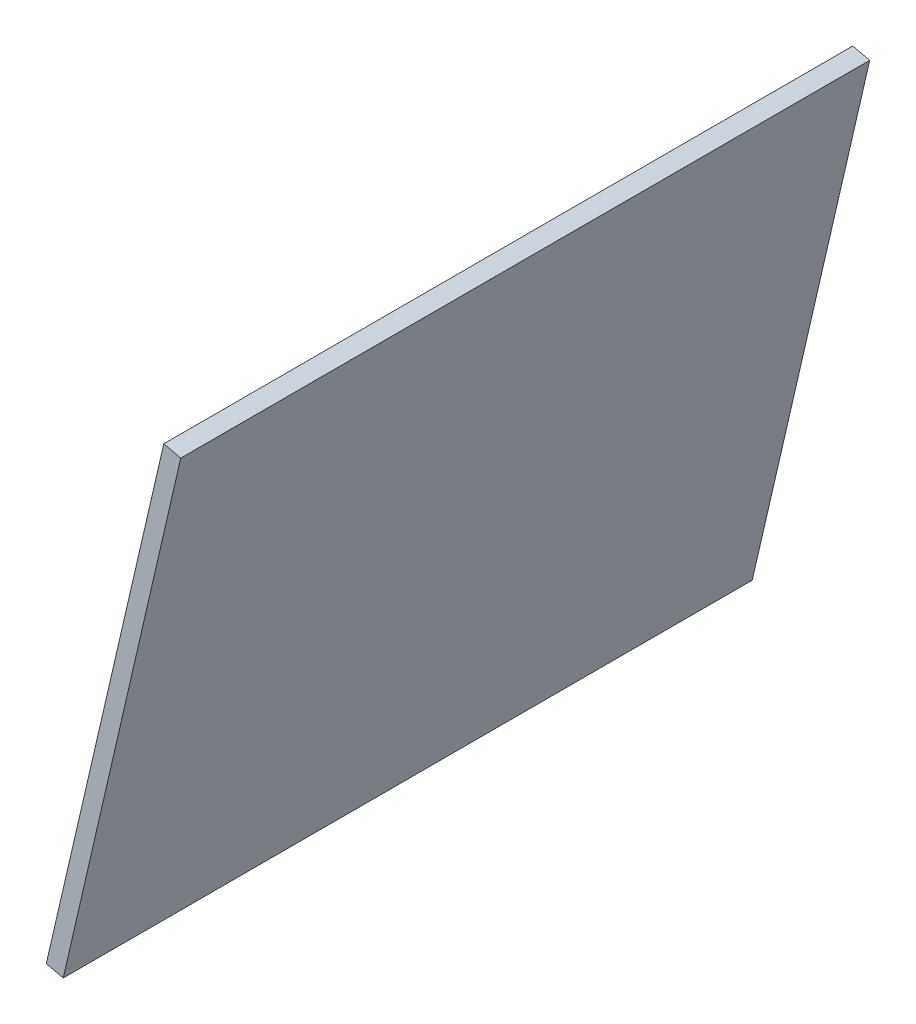
ISO-10303-21;
HEADER;
FILE_DESCRIPTION(('STEP AP214'),'2;1');
FILE_NAME('part.step','',(''),(''),'','','');
FILE_SCHEMA(('AUTOMOTIVE_DESIGN { 1 0 10303 214 1 1 1 1 }'));
ENDSEC;
DATA;
#1=APPLICATION_CONTEXT('core data for automotive mechanical design processes');
#2=APPLICATION_PROTOCOL_DEFINITION('international standard','automotive_design',2000,#1);
#3=PRODUCT_CONTEXT('',#1,'mechanical');
#4=PRODUCT('Part','Part','',(#3));
#5=PRODUCT_RELATED_PRODUCT_CATEGORY('part','',(#4));
#6=PRODUCT_DEFINITION_FORMATION('','',#4);
#7=PRODUCT_DEFINITION_CONTEXT('part definition',#1,'design');
#8=PRODUCT_DEFINITION('design','',#6,#7);
#9=PRODUCT_DEFINITION_SHAPE('','',#8);
#10=(LENGTH_UNIT() NAMED_UNIT(*) SI_UNIT(.MILLI.,.METRE.));
#11=(NAMED_UNIT(*) PLANE_ANGLE_UNIT() SI_UNIT($,.RADIAN.));
#12=(NAMED_UNIT(*) SI_UNIT($,.STERADIAN.) SOLID_ANGLE_UNIT());
#13=UNCERTAINTY_MEASURE_WITH_UNIT(LENGTH_MEASURE(1.E-05),#10,'distance_accuracy_value','');
#14=(GEOMETRIC_REPRESENTATION_CONTEXT(3) GLOBAL_UNCERTAINTY_ASSIGNED_CONTEXT((#13)) GLOBAL_UNIT_ASSIGNED_CONTEXT((#10,
#11,#12)) REPRESENTATION_CONTEXT('',''));
#15=CARTESIAN_POINT('',(0.,0.,0.));
#16=DIRECTION('',(0.,0.,1.));
#17=DIRECTION('',(1.,0.,0.));
#18=AXIS2_PLACEMENT_3D('',#15,#16,#17);
#19=CARTESIAN_POINT('',(164.308235452831,1831.59349845867,402.));
#20=DIRECTION('',(-0.224951054343888,-0.97437006478523,0.));
#21=DIRECTION('',(0.97437006478523,-0.224951054343888,0.));
#22=AXIS2_PLACEMENT_3D('',#19,#20,#21);
#23=PLANE('',#22);
#24=DIRECTION('',(-0.97437006478523,0.224951054343888,0.));
#25=VECTOR('',#24,1.);
#26=CARTESIAN_POINT('',(164.308235452831,1831.59349845867,0.));
#27=LINE('',#26,#25);
#28=CARTESIAN_POINT('',(174.20783531105,1829.30799574654,0.));
#29=VERTEX_POINT('',#28);
#30=CARTESIAN_POINT('',(164.308235452831,1831.59349845867,0.));
#31=VERTEX_POINT('',#30);
#32=EDGE_CURVE('E99',#29,#31,#27,.T.);
#33=ORIENTED_EDGE('',*,*,#32,.T.);
#34=DIRECTION('',(0.,0.,-1.));
#35=VECTOR('',#34,1.);
#36=CARTESIAN_POINT('',(164.308235452831,1831.59349845867,402.));
#37=LINE('',#36,#35);
#38=CARTESIAN_POINT('',(164.308235452831,1831.59349845867,402.));
#39=VERTEX_POINT('',#38);
#40=EDGE_CURVE('E11',#39,#31,#37,.T.);
#41=ORIENTED_EDGE('',*,*,#40,.F.);
#42=DIRECTION('',(-0.97437006478523,0.224951054343888,0.));
#43=VECTOR('',#42,1.);
#44=CARTESIAN_POINT('',(164.308235452831,1831.59349845867,402.));
#45=LINE('',#44,#43);
#46=CARTESIAN_POINT('',(174.20783531105,1829.30799574654,402.));
#47=VERTEX_POINT('',#46);
#48=EDGE_CURVE('E87',#47,#39,#45,.T.);
#49=ORIENTED_EDGE('',*,*,#48,.F.);
#50=DIRECTION('',(0.,0.,-1.));
#51=VECTOR('',#50,1.);
#52=CARTESIAN_POINT('',(174.20783531105,1829.30799574654,402.));
#53=LINE('',#52,#51);
#54=EDGE_CURVE('E95',#47,#29,#53,.T.);
#55=ORIENTED_EDGE('',*,*,#54,.T.);
#56=EDGE_LOOP('',(#33,#41,#49,#55));
#57=FACE_BOUND('',#56,.T.);
#58=ADVANCED_FACE('F36',(#57),#23,.F.);
#59=CARTESIAN_POINT('',(95.7431540888192,1534.60550271213,402.));
#60=DIRECTION('',(0.974370064785234,-0.224951054343871,0.));
#61=DIRECTION('',(0.224951054343871,0.974370064785234,0.));
#62=AXIS2_PLACEMENT_3D('',#59,#60,#61);
#63=PLANE('',#62);
#64=DIRECTION('',(-0.224951054343871,-0.974370064785234,0.));
#65=VECTOR('',#64,1.);
#66=CARTESIAN_POINT('',(95.7431540888192,1534.60550271213,0.));
#67=LINE('',#66,#65);
#68=CARTESIAN_POINT('',(95.7431540888192,1534.60550271213,0.));
#69=VERTEX_POINT('',#68);
#70=EDGE_CURVE('E91',#31,#69,#67,.T.);
#71=ORIENTED_EDGE('',*,*,#70,.T.);
#72=DIRECTION('',(0.,0.,-1.));
#73=VECTOR('',#72,1.);
#74=CARTESIAN_POINT('',(95.7431540888192,1534.60550271213,402.));
#75=LINE('',#74,#73);
#76=CARTESIAN_POINT('',(95.7431540888192,1534.60550271213,402.));
#77=VERTEX_POINT('',#76);
#78=EDGE_CURVE('E44',#77,#69,#75,.T.);
#79=ORIENTED_EDGE('',*,*,#78,.F.);
#80=DIRECTION('',(-0.224951054343871,-0.974370064785234,0.));
#81=VECTOR('',#80,1.);
#82=CARTESIAN_POINT('',(95.7431540888192,1534.60550271213,402.));
#83=LINE('',#82,#81);
#84=EDGE_CURVE('E82',#39,#77,#83,.T.);
#85=ORIENTED_EDGE('',*,*,#84,.F.);
#86=ORIENTED_EDGE('',*,*,#40,.T.);
#87=EDGE_LOOP('',(#71,#79,#85,#86));
#88=FACE_BOUND('',#87,.T.);
#89=ADVANCED_FACE('F90',(#88),#63,.F.);
#90=CARTESIAN_POINT('',(105.642753947037,1532.32,402.));
#91=DIRECTION('',(0.224951054343871,0.974370064785234,0.));
#92=DIRECTION('',(-0.974370064785234,0.224951054343871,0.));
#93=AXIS2_PLACEMENT_3D('',#90,#91,#92);
#94=PLANE('',#93);
#95=DIRECTION('',(0.974370064785234,-0.224951054343871,0.));
#96=VECTOR('',#95,1.);
#97=CARTESIAN_POINT('',(105.642753947037,1532.32,0.));
#98=LINE('',#97,#96);
#99=CARTESIAN_POINT('',(105.642753947037,1532.32,0.));
#100=VERTEX_POINT('',#99);
#101=EDGE_CURVE('E69',#69,#100,#98,.T.);
#102=ORIENTED_EDGE('',*,*,#101,.T.);
#103=DIRECTION('',(0.,0.,-1.));
#104=VECTOR('',#103,1.);
#105=CARTESIAN_POINT('',(105.642753947037,1532.32,402.));
#106=LINE('',#105,#104);
#107=CARTESIAN_POINT('',(105.642753947037,1532.32,402.));
#108=VERTEX_POINT('',#107);
#109=EDGE_CURVE('E92',#108,#100,#106,.T.);
#110=ORIENTED_EDGE('',*,*,#109,.F.);
#111=DIRECTION('',(0.974370064785234,-0.224951054343871,0.));
#112=VECTOR('',#111,1.);
#113=CARTESIAN_POINT('',(105.642753947037,1532.32,402.));
#114=LINE('',#113,#112);
#115=EDGE_CURVE('E85',#77,#108,#114,.T.);
#116=ORIENTED_EDGE('',*,*,#115,.F.);
#117=ORIENTED_EDGE('',*,*,#78,.T.);
#118=EDGE_LOOP('',(#102,#110,#116,#117));
#119=FACE_BOUND('',#118,.T.);
#120=ADVANCED_FACE('F93',(#119),#94,.F.);
#121=CARTESIAN_POINT('',(174.20783531105,1829.30799574654,402.));
#122=DIRECTION('',(-0.974370064785234,0.224951054343872,0.));
#123=DIRECTION('',(-0.224951054343872,-0.974370064785234,0.));
#124=AXIS2_PLACEMENT_3D('',#121,#122,#123);
#125=PLANE('',#124);
#126=DIRECTION('',(0.224951054343872,0.974370064785234,0.));
#127=VECTOR('',#126,1.);
#128=CARTESIAN_POINT('',(174.20783531105,1829.30799574654,0.));
#129=LINE('',#128,#127);
#130=EDGE_CURVE('E75',#100,#29,#129,.T.);
#131=ORIENTED_EDGE('',*,*,#130,.T.);
#132=ORIENTED_EDGE('',*,*,#54,.F.);
#133=DIRECTION('',(0.224951054343872,0.974370064785234,0.));
#134=VECTOR('',#133,1.);
#135=CARTESIAN_POINT('',(174.20783531105,1829.30799574654,402.));
#136=LINE('',#135,#134);
#137=EDGE_CURVE('E52',#108,#47,#136,.T.);
#138=ORIENTED_EDGE('',*,*,#137,.F.);
#139=ORIENTED_EDGE('',*,*,#109,.T.);
#140=EDGE_LOOP('',(#131,#132,#138,#139));
#141=FACE_BOUND('',#140,.T.);
#142=ADVANCED_FACE('F106',(#141),#125,.F.);
#143=CARTESIAN_POINT('',(0.,0.,402.));
#144=DIRECTION('',(0.,0.,-1.));
#145=DIRECTION('',(-1.,0.,0.));
#146=AXIS2_PLACEMENT_3D('',#143,#144,#145);
#147=PLANE('',#146);
#148=ORIENTED_EDGE('',*,*,#48,.T.);
#149=ORIENTED_EDGE('',*,*,#84,.T.);
#150=ORIENTED_EDGE('',*,*,#115,.T.);
#151=ORIENTED_EDGE('',*,*,#137,.T.);
#152=EDGE_LOOP('',(#148,#149,#150,#151));
#153=FACE_BOUND('',#152,.T.);
#154=ADVANCED_FACE('F83',(#153),#147,.F.);
#155=CARTESIAN_POINT('',(0.,0.,0.));
#156=DIRECTION('',(0.,0.,-1.));
#157=DIRECTION('',(-1.,0.,0.));
#158=AXIS2_PLACEMENT_3D('',#155,#156,#157);
#159=PLANE('',#158);
#160=ORIENTED_EDGE('',*,*,#32,.F.);
#161=ORIENTED_EDGE('',*,*,#130,.F.);
#162=ORIENTED_EDGE('',*,*,#101,.F.);
#163=ORIENTED_EDGE('',*,*,#70,.F.);
#164=EDGE_LOOP('',(#160,#161,#162,#163));
#165=FACE_BOUND('',#164,.T.);
#166=ADVANCED_FACE('F109',(#165),#159,.T.);
#167=CLOSED_SHELL('',(#58,#89,#120,#142,#154,#166));
#168=MANIFOLD_SOLID_BREP('B2',#167);
#169=ADVANCED_BREP_SHAPE_REPRESENTATION('',(#18,#168),#14);
#170=SHAPE_DEFINITION_REPRESENTATION(#9,#169);
ENDSEC;
END-ISO-10303-21;
